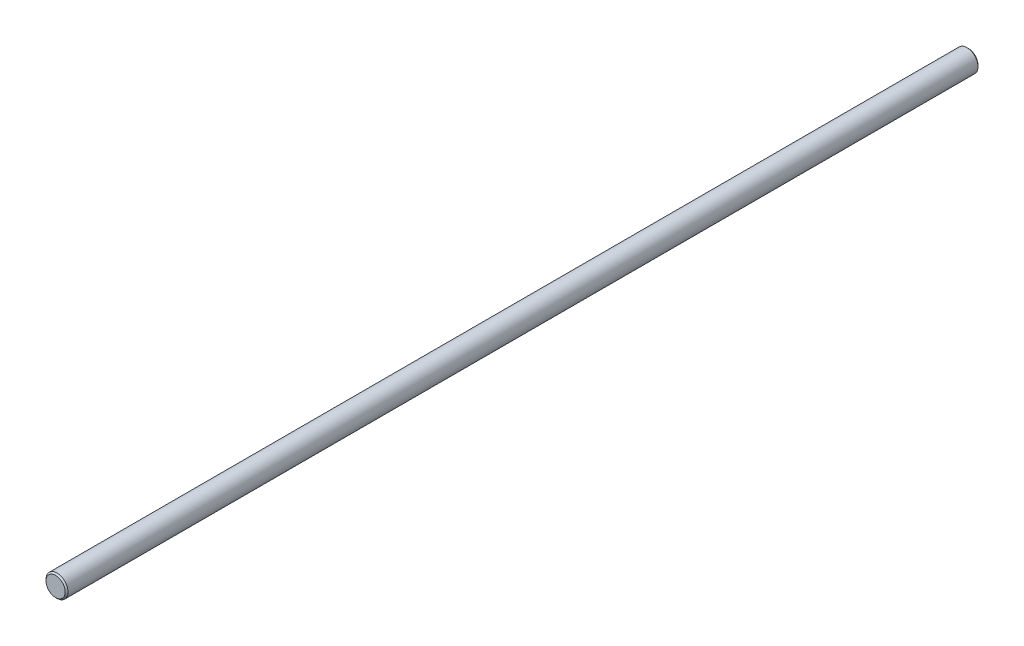
ISO-10303-21;
HEADER;
FILE_DESCRIPTION(('STEP AP214'),'2;1');
FILE_NAME('part.step','',(''),(''),'','','');
FILE_SCHEMA(('AUTOMOTIVE_DESIGN { 1 0 10303 214 1 1 1 1 }'));
ENDSEC;
DATA;
#1=APPLICATION_CONTEXT('core data for automotive mechanical design processes');
#2=APPLICATION_PROTOCOL_DEFINITION('international standard','automotive_design',2000,#1);
#3=PRODUCT_CONTEXT('',#1,'mechanical');
#4=PRODUCT('Part','Part','',(#3));
#5=PRODUCT_RELATED_PRODUCT_CATEGORY('part','',(#4));
#6=PRODUCT_DEFINITION_FORMATION('','',#4);
#7=PRODUCT_DEFINITION_CONTEXT('part definition',#1,'design');
#8=PRODUCT_DEFINITION('design','',#6,#7);
#9=PRODUCT_DEFINITION_SHAPE('','',#8);
#10=(LENGTH_UNIT() NAMED_UNIT(*) SI_UNIT(.MILLI.,.METRE.));
#11=(NAMED_UNIT(*) PLANE_ANGLE_UNIT() SI_UNIT($,.RADIAN.));
#12=(NAMED_UNIT(*) SI_UNIT($,.STERADIAN.) SOLID_ANGLE_UNIT());
#13=UNCERTAINTY_MEASURE_WITH_UNIT(LENGTH_MEASURE(1.E-05),#10,'distance_accuracy_value','');
#14=(GEOMETRIC_REPRESENTATION_CONTEXT(3) GLOBAL_UNCERTAINTY_ASSIGNED_CONTEXT((#13)) GLOBAL_UNIT_ASSIGNED_CONTEXT((#10,
#11,#12)) REPRESENTATION_CONTEXT('',''));
#15=CARTESIAN_POINT('',(0.,0.,0.));
#16=DIRECTION('',(0.,0.,1.));
#17=DIRECTION('',(1.,0.,0.));
#18=AXIS2_PLACEMENT_3D('',#15,#16,#17);
#19=CARTESIAN_POINT('',(0.,0.,-343.513708498985));
#20=DIRECTION('',(0.,0.,1.));
#21=DIRECTION('',(0.,-1.,0.));
#22=AXIS2_PLACEMENT_3D('',#19,#20,#21);
#23=CYLINDRICAL_SURFACE('',#22,4.);
#24=CARTESIAN_POINT('',(0.,0.,-331.7));
#25=DIRECTION('',(0.,0.,1.));
#26=DIRECTION('',(0.,-1.,0.));
#27=AXIS2_PLACEMENT_3D('',#24,#25,#26);
#28=CIRCLE('',#27,4.);
#29=CARTESIAN_POINT('',(0.,-4.00000000000001,-331.7));
#30=VERTEX_POINT('',#29);
#31=EDGE_CURVE('E37',#30,#30,#28,.T.);
#32=ORIENTED_EDGE('',*,*,#31,.T.);
#33=EDGE_LOOP('',(#32));
#34=FACE_BOUND('',#33,.T.);
#35=CARTESIAN_POINT('',(0.,0.,-0.500000000000056));
#36=DIRECTION('',(0.,0.,1.));
#37=DIRECTION('',(0.,-1.,0.));
#38=AXIS2_PLACEMENT_3D('',#35,#36,#37);
#39=CIRCLE('',#38,4.);
#40=CARTESIAN_POINT('',(0.,-4.,-0.500000000000056));
#41=VERTEX_POINT('',#40);
#42=EDGE_CURVE('E41',#41,#41,#39,.F.);
#43=ORIENTED_EDGE('',*,*,#42,.T.);
#44=EDGE_LOOP('',(#43));
#45=FACE_BOUND('',#44,.T.);
#46=ADVANCED_FACE('F30',(#34,#45),#23,.T.);
#47=CARTESIAN_POINT('',(0.,0.,0.));
#48=DIRECTION('',(0.,0.,1.));
#49=DIRECTION('',(1.,0.,0.));
#50=AXIS2_PLACEMENT_3D('',#47,#48,#49);
#51=PLANE('',#50);
#52=CARTESIAN_POINT('',(0.,0.,0.));
#53=DIRECTION('',(0.,0.,1.));
#54=DIRECTION('',(1.,0.,0.));
#55=AXIS2_PLACEMENT_3D('',#52,#53,#54);
#56=CIRCLE('',#55,3.49999999999998);
#57=CARTESIAN_POINT('',(3.49999999999998,0.,0.));
#58=VERTEX_POINT('',#57);
#59=EDGE_CURVE('E10',#58,#58,#56,.T.);
#60=ORIENTED_EDGE('',*,*,#59,.T.);
#61=EDGE_LOOP('',(#60));
#62=FACE_BOUND('',#61,.T.);
#63=ADVANCED_FACE('F61',(#62),#51,.T.);
#64=CARTESIAN_POINT('',(8.32555166400556E-13,-4.00000000000008,-332.2));
#65=DIRECTION('',(0.,0.,1.));
#66=DIRECTION('',(0.,-1.,0.));
#67=AXIS2_PLACEMENT_3D('',#64,#65,#66);
#68=PLANE('',#67);
#69=CARTESIAN_POINT('',(0.,0.,-332.2));
#70=DIRECTION('',(0.,0.,1.));
#71=DIRECTION('',(1.,0.,0.));
#72=AXIS2_PLACEMENT_3D('',#69,#70,#71);
#73=CIRCLE('',#72,3.50000000000003);
#74=CARTESIAN_POINT('',(3.50000000000003,0.,-332.2));
#75=VERTEX_POINT('',#74);
#76=EDGE_CURVE('E45',#75,#75,#73,.F.);
#77=ORIENTED_EDGE('',*,*,#76,.T.);
#78=EDGE_LOOP('',(#77));
#79=FACE_BOUND('',#78,.T.);
#80=ADVANCED_FACE('F51',(#79),#68,.F.);
#81=CARTESIAN_POINT('',(0.,0.,-332.2));
#82=DIRECTION('',(0.,0.,1.));
#83=DIRECTION('',(0.,-1.,0.));
#84=AXIS2_PLACEMENT_3D('',#81,#82,#83);
#85=CONICAL_SURFACE('',#84,3.50000000000003,0.785398163397473);
#86=ORIENTED_EDGE('',*,*,#31,.F.);
#87=EDGE_LOOP('',(#86));
#88=FACE_BOUND('',#87,.T.);
#89=ORIENTED_EDGE('',*,*,#76,.F.);
#90=EDGE_LOOP('',(#89));
#91=FACE_BOUND('',#90,.T.);
#92=ADVANCED_FACE('F53',(#88,#91),#85,.T.);
#93=CARTESIAN_POINT('',(0.,0.,0.));
#94=DIRECTION('',(0.,0.,-1.));
#95=DIRECTION('',(0.,1.,0.));
#96=AXIS2_PLACEMENT_3D('',#93,#94,#95);
#97=CONICAL_SURFACE('',#96,3.49999999999998,0.785398163397417);
#98=ORIENTED_EDGE('',*,*,#42,.F.);
#99=EDGE_LOOP('',(#98));
#100=FACE_BOUND('',#99,.T.);
#101=ORIENTED_EDGE('',*,*,#59,.F.);
#102=EDGE_LOOP('',(#101));
#103=FACE_BOUND('',#102,.T.);
#104=ADVANCED_FACE('F32',(#100,#103),#97,.T.);
#105=CLOSED_SHELL('',(#46,#63,#80,#92,#104));
#106=MANIFOLD_SOLID_BREP('B2',#105);
#107=ADVANCED_BREP_SHAPE_REPRESENTATION('',(#18,#106),#14);
#108=SHAPE_DEFINITION_REPRESENTATION(#9,#107);
ENDSEC;
END-ISO-10303-21;
